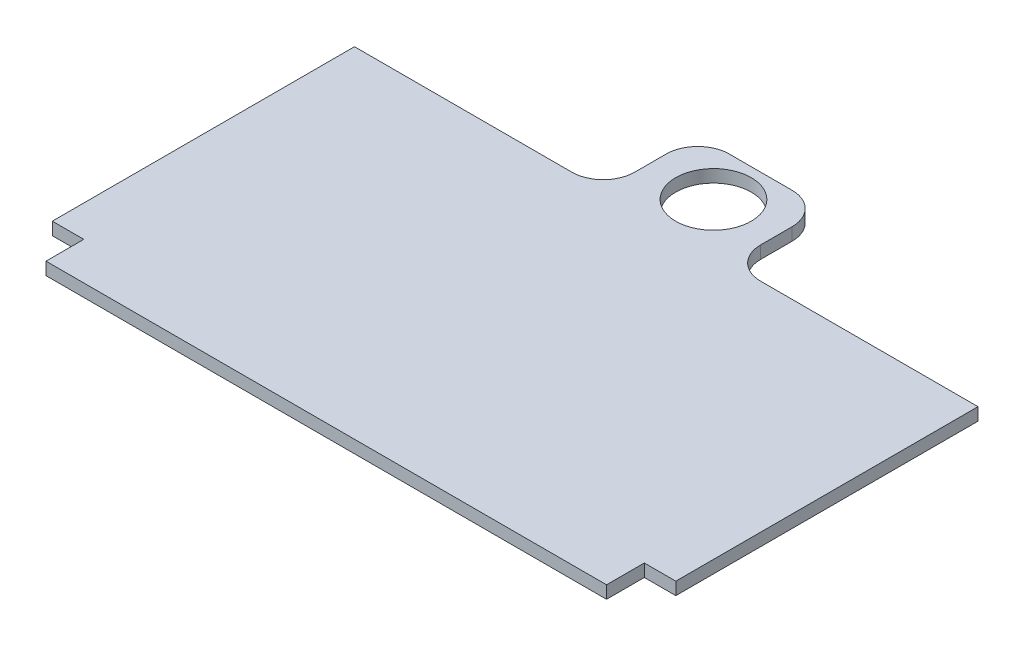
ISO-10303-21;
HEADER;
FILE_DESCRIPTION(('STEP AP214'),'2;1');
FILE_NAME('part.step','',(''),(''),'','','');
FILE_SCHEMA(('AUTOMOTIVE_DESIGN { 1 0 10303 214 1 1 1 1 }'));
ENDSEC;
DATA;
#1=APPLICATION_CONTEXT('core data for automotive mechanical design processes');
#2=APPLICATION_PROTOCOL_DEFINITION('international standard','automotive_design',2000,#1);
#3=PRODUCT_CONTEXT('',#1,'mechanical');
#4=PRODUCT('Part','Part','',(#3));
#5=PRODUCT_RELATED_PRODUCT_CATEGORY('part','',(#4));
#6=PRODUCT_DEFINITION_FORMATION('','',#4);
#7=PRODUCT_DEFINITION_CONTEXT('part definition',#1,'design');
#8=PRODUCT_DEFINITION('design','',#6,#7);
#9=PRODUCT_DEFINITION_SHAPE('','',#8);
#10=(LENGTH_UNIT() NAMED_UNIT(*) SI_UNIT(.MILLI.,.METRE.));
#11=(NAMED_UNIT(*) PLANE_ANGLE_UNIT() SI_UNIT($,.RADIAN.));
#12=(NAMED_UNIT(*) SI_UNIT($,.STERADIAN.) SOLID_ANGLE_UNIT());
#13=UNCERTAINTY_MEASURE_WITH_UNIT(LENGTH_MEASURE(1.E-05),#10,'distance_accuracy_value','');
#14=(GEOMETRIC_REPRESENTATION_CONTEXT(3) GLOBAL_UNCERTAINTY_ASSIGNED_CONTEXT((#13)) GLOBAL_UNIT_ASSIGNED_CONTEXT((#10,
#11,#12)) REPRESENTATION_CONTEXT('',''));
#15=CARTESIAN_POINT('',(0.,0.,0.));
#16=DIRECTION('',(0.,0.,1.));
#17=DIRECTION('',(1.,0.,0.));
#18=AXIS2_PLACEMENT_3D('',#15,#16,#17);
#19=CARTESIAN_POINT('',(0.,0.,-48.));
#20=DIRECTION('',(0.,0.,-1.));
#21=DIRECTION('',(0.,-1.,0.));
#22=AXIS2_PLACEMENT_3D('',#19,#20,#21);
#23=PLANE('',#22);
#24=DIRECTION('',(-1.,0.,0.));
#25=VECTOR('',#24,1.);
#26=CARTESIAN_POINT('',(85.,-86.5,-48.));
#27=LINE('',#26,#25);
#28=CARTESIAN_POINT('',(179.030435910037,-86.5,-48.));
#29=VERTEX_POINT('',#28);
#30=CARTESIAN_POINT('',(144.515217955019,-86.5,-48.));
#31=VERTEX_POINT('',#30);
#32=EDGE_CURVE('E212',#29,#31,#27,.T.);
#33=ORIENTED_EDGE('',*,*,#32,.F.);
#34=DIRECTION('',(0.,1.,0.));
#35=VECTOR('',#34,1.);
#36=CARTESIAN_POINT('',(179.030435910037,-86.5,-48.));
#37=LINE('',#36,#35);
#38=CARTESIAN_POINT('',(179.030435910037,-88.5,-48.));
#39=VERTEX_POINT('',#38);
#40=EDGE_CURVE('E201',#39,#29,#37,.T.);
#41=ORIENTED_EDGE('',*,*,#40,.F.);
#42=DIRECTION('',(1.,0.,0.));
#43=VECTOR('',#42,1.);
#44=CARTESIAN_POINT('',(85.,-88.5,-48.));
#45=LINE('',#44,#43);
#46=CARTESIAN_POINT('',(144.515217955019,-88.5,-48.));
#47=VERTEX_POINT('',#46);
#48=EDGE_CURVE('E183',#47,#39,#45,.T.);
#49=ORIENTED_EDGE('',*,*,#48,.F.);
#50=DIRECTION('',(0.,-1.,0.));
#51=VECTOR('',#50,1.);
#52=CARTESIAN_POINT('',(144.515217955019,-88.5,-48.));
#53=LINE('',#52,#51);
#54=EDGE_CURVE('E182',#31,#47,#53,.T.);
#55=ORIENTED_EDGE('',*,*,#54,.F.);
#56=EDGE_LOOP('',(#33,#41,#49,#55));
#57=FACE_BOUND('',#56,.T.);
#58=ADVANCED_FACE('F39',(#57),#23,.T.);
#59=CARTESIAN_POINT('',(85.,-86.5,-137.052897304531));
#60=DIRECTION('',(1.,0.,0.));
#61=DIRECTION('',(0.,0.,1.));
#62=AXIS2_PLACEMENT_3D('',#59,#60,#61);
#63=PLANE('',#62);
#64=DIRECTION('',(0.,0.,1.));
#65=VECTOR('',#64,1.);
#66=CARTESIAN_POINT('',(85.,-88.5,-137.052897304531));
#67=LINE('',#66,#65);
#68=CARTESIAN_POINT('',(85.,-88.5,0.));
#69=VERTEX_POINT('',#68);
#70=CARTESIAN_POINT('',(85.,-88.5,6.00000000000001));
#71=VERTEX_POINT('',#70);
#72=EDGE_CURVE('E356',#69,#71,#67,.T.);
#73=ORIENTED_EDGE('',*,*,#72,.T.);
#74=DIRECTION('',(0.,1.,0.));
#75=VECTOR('',#74,1.);
#76=CARTESIAN_POINT('',(85.,-86.5,6.00000000000001));
#77=LINE('',#76,#75);
#78=CARTESIAN_POINT('',(85.,-86.5,6.00000000000001));
#79=VERTEX_POINT('',#78);
#80=EDGE_CURVE('E347',#71,#79,#77,.T.);
#81=ORIENTED_EDGE('',*,*,#80,.T.);
#82=DIRECTION('',(0.,0.,1.));
#83=VECTOR('',#82,1.);
#84=CARTESIAN_POINT('',(85.,-86.5,-137.052897304531));
#85=LINE('',#84,#83);
#86=CARTESIAN_POINT('',(85.,-86.5,0.));
#87=VERTEX_POINT('',#86);
#88=EDGE_CURVE('E351',#87,#79,#85,.T.);
#89=ORIENTED_EDGE('',*,*,#88,.F.);
#90=DIRECTION('',(0.,1.,0.));
#91=VECTOR('',#90,1.);
#92=CARTESIAN_POINT('',(85.,-86.5,0.));
#93=LINE('',#92,#91);
#94=EDGE_CURVE('E172',#69,#87,#93,.T.);
#95=ORIENTED_EDGE('',*,*,#94,.F.);
#96=EDGE_LOOP('',(#73,#81,#89,#95));
#97=FACE_BOUND('',#96,.T.);
#98=ADVANCED_FACE('F393',(#97),#63,.F.);
#99=CARTESIAN_POINT('',(174.030435910037,-86.5,-137.052897304531));
#100=DIRECTION('',(-1.,0.,0.));
#101=DIRECTION('',(0.,0.,-1.));
#102=AXIS2_PLACEMENT_3D('',#99,#100,#101);
#103=PLANE('',#102);
#104=DIRECTION('',(0.,1.,0.));
#105=VECTOR('',#104,1.);
#106=CARTESIAN_POINT('',(174.030435910037,-86.5,0.));
#107=LINE('',#106,#105);
#108=CARTESIAN_POINT('',(174.030435910037,-88.5,0.));
#109=VERTEX_POINT('',#108);
#110=CARTESIAN_POINT('',(174.030435910037,-86.5,0.));
#111=VERTEX_POINT('',#110);
#112=EDGE_CURVE('E316',#109,#111,#107,.T.);
#113=ORIENTED_EDGE('',*,*,#112,.T.);
#114=DIRECTION('',(0.,0.,1.));
#115=VECTOR('',#114,1.);
#116=CARTESIAN_POINT('',(174.030435910037,-86.5,-137.052897304531));
#117=LINE('',#116,#115);
#118=CARTESIAN_POINT('',(174.030435910037,-86.5,6.00000000000001));
#119=VERTEX_POINT('',#118);
#120=EDGE_CURVE('E228',#111,#119,#117,.T.);
#121=ORIENTED_EDGE('',*,*,#120,.T.);
#122=DIRECTION('',(0.,-1.,0.));
#123=VECTOR('',#122,1.);
#124=CARTESIAN_POINT('',(174.030435910037,-86.5,6.00000000000001));
#125=LINE('',#124,#123);
#126=CARTESIAN_POINT('',(174.030435910037,-88.5,6.00000000000003));
#127=VERTEX_POINT('',#126);
#128=EDGE_CURVE('E339',#119,#127,#125,.T.);
#129=ORIENTED_EDGE('',*,*,#128,.T.);
#130=DIRECTION('',(0.,0.,1.));
#131=VECTOR('',#130,1.);
#132=CARTESIAN_POINT('',(174.030435910037,-88.5,-137.052897304531));
#133=LINE('',#132,#131);
#134=EDGE_CURVE('E361',#109,#127,#133,.T.);
#135=ORIENTED_EDGE('',*,*,#134,.F.);
#136=EDGE_LOOP('',(#113,#121,#129,#135));
#137=FACE_BOUND('',#136,.T.);
#138=ADVANCED_FACE('F398',(#137),#103,.F.);
#139=CARTESIAN_POINT('',(85.,-88.5,-137.052897304531));
#140=DIRECTION('',(0.,1.,0.));
#141=DIRECTION('',(0.,0.,-1.));
#142=AXIS2_PLACEMENT_3D('',#139,#140,#141);
#143=PLANE('',#142);
#144=CARTESIAN_POINT('',(129.515217955019,-88.5,-55.5));
#145=DIRECTION('',(0.,1.,0.));
#146=DIRECTION('',(0.,0.,1.));
#147=AXIS2_PLACEMENT_3D('',#144,#145,#146);
#148=CIRCLE('',#147,6.00000000000002);
#149=CARTESIAN_POINT('',(129.515217955019,-88.5,-49.5));
#150=VERTEX_POINT('',#149);
#151=EDGE_CURVE('E260',#150,#150,#148,.T.);
#152=ORIENTED_EDGE('',*,*,#151,.T.);
#153=EDGE_LOOP('',(#152));
#154=FACE_BOUND('',#153,.T.);
#155=DIRECTION('',(-1.,0.,0.));
#156=VECTOR('',#155,1.);
#157=CARTESIAN_POINT('',(119.515217955019,-88.5,-63.));
#158=LINE('',#157,#156);
#159=CARTESIAN_POINT('',(134.515217955019,-88.5,-63.));
#160=VERTEX_POINT('',#159);
#161=CARTESIAN_POINT('',(124.515217955019,-88.5,-63.));
#162=VERTEX_POINT('',#161);
#163=EDGE_CURVE('E257',#160,#162,#158,.T.);
#164=ORIENTED_EDGE('',*,*,#163,.F.);
#165=CARTESIAN_POINT('',(134.515217955019,-88.5,-58.));
#166=DIRECTION('',(0.,-1.,0.));
#167=DIRECTION('',(0.,0.,-1.));
#168=AXIS2_PLACEMENT_3D('',#165,#166,#167);
#169=CIRCLE('',#168,5.);
#170=CARTESIAN_POINT('',(139.515217955019,-88.5,-58.));
#171=VERTEX_POINT('',#170);
#172=EDGE_CURVE('E234',#171,#160,#169,.F.);
#173=ORIENTED_EDGE('',*,*,#172,.F.);
#174=DIRECTION('',(0.,0.,-1.));
#175=VECTOR('',#174,1.);
#176=CARTESIAN_POINT('',(139.515217955019,-88.5,-48.));
#177=LINE('',#176,#175);
#178=CARTESIAN_POINT('',(139.515217955019,-88.5,-53.));
#179=VERTEX_POINT('',#178);
#180=EDGE_CURVE('E253',#179,#171,#177,.T.);
#181=ORIENTED_EDGE('',*,*,#180,.F.);
#182=CARTESIAN_POINT('',(144.515217955019,-88.5,-53.));
#183=DIRECTION('',(0.,-1.,0.));
#184=DIRECTION('',(0.,0.,-1.));
#185=AXIS2_PLACEMENT_3D('',#182,#183,#184);
#186=CIRCLE('',#185,5.);
#187=EDGE_CURVE('E243',#47,#179,#186,.T.);
#188=ORIENTED_EDGE('',*,*,#187,.F.);
#189=ORIENTED_EDGE('',*,*,#48,.T.);
#190=DIRECTION('',(0.,0.,1.));
#191=VECTOR('',#190,1.);
#192=CARTESIAN_POINT('',(179.030435910037,-88.5,0.));
#193=LINE('',#192,#191);
#194=CARTESIAN_POINT('',(179.030435910037,-88.5,0.));
#195=VERTEX_POINT('',#194);
#196=EDGE_CURVE('E310',#39,#195,#193,.T.);
#197=ORIENTED_EDGE('',*,*,#196,.T.);
#198=DIRECTION('',(-1.,0.,0.));
#199=VECTOR('',#198,1.);
#200=CARTESIAN_POINT('',(179.030435910037,-88.5,0.));
#201=LINE('',#200,#199);
#202=EDGE_CURVE('E333',#195,#109,#201,.T.);
#203=ORIENTED_EDGE('',*,*,#202,.T.);
#204=ORIENTED_EDGE('',*,*,#134,.T.);
#205=DIRECTION('',(-1.,0.,0.));
#206=VECTOR('',#205,1.);
#207=CARTESIAN_POINT('',(85.,-88.5,6.00000000000001));
#208=LINE('',#207,#206);
#209=EDGE_CURVE('E349',#127,#71,#208,.T.);
#210=ORIENTED_EDGE('',*,*,#209,.T.);
#211=ORIENTED_EDGE('',*,*,#72,.F.);
#212=DIRECTION('',(1.,0.,0.));
#213=VECTOR('',#212,1.);
#214=CARTESIAN_POINT('',(80.,-88.5,0.));
#215=LINE('',#214,#213);
#216=CARTESIAN_POINT('',(80.,-88.5,0.));
#217=VERTEX_POINT('',#216);
#218=EDGE_CURVE('E188',#217,#69,#215,.T.);
#219=ORIENTED_EDGE('',*,*,#218,.F.);
#220=DIRECTION('',(0.,0.,1.));
#221=VECTOR('',#220,1.);
#222=CARTESIAN_POINT('',(80.,-88.5,0.));
#223=LINE('',#222,#221);
#224=CARTESIAN_POINT('',(80.,-88.5,-48.));
#225=VERTEX_POINT('',#224);
#226=EDGE_CURVE('E165',#225,#217,#223,.T.);
#227=ORIENTED_EDGE('',*,*,#226,.F.);
#228=CARTESIAN_POINT('',(114.515217955019,-88.5,-48.));
#229=VERTEX_POINT('',#228);
#230=EDGE_CURVE('E176',#225,#229,#45,.T.);
#231=ORIENTED_EDGE('',*,*,#230,.T.);
#232=CARTESIAN_POINT('',(114.515217955019,-88.5,-53.));
#233=DIRECTION('',(0.,-1.,0.));
#234=DIRECTION('',(0.,0.,-1.));
#235=AXIS2_PLACEMENT_3D('',#232,#233,#234);
#236=CIRCLE('',#235,5.);
#237=CARTESIAN_POINT('',(119.515217955019,-88.5,-53.));
#238=VERTEX_POINT('',#237);
#239=EDGE_CURVE('E47',#238,#229,#236,.T.);
#240=ORIENTED_EDGE('',*,*,#239,.F.);
#241=DIRECTION('',(0.,0.,1.));
#242=VECTOR('',#241,1.);
#243=CARTESIAN_POINT('',(119.515217955019,-88.5,-48.));
#244=LINE('',#243,#242);
#245=CARTESIAN_POINT('',(119.515217955019,-88.5,-58.));
#246=VERTEX_POINT('',#245);
#247=EDGE_CURVE('E251',#246,#238,#244,.T.);
#248=ORIENTED_EDGE('',*,*,#247,.F.);
#249=CARTESIAN_POINT('',(124.515217955019,-88.5,-58.));
#250=DIRECTION('',(0.,-1.,0.));
#251=DIRECTION('',(0.,0.,-1.));
#252=AXIS2_PLACEMENT_3D('',#249,#250,#251);
#253=CIRCLE('',#252,5.);
#254=EDGE_CURVE('E236',#162,#246,#253,.F.);
#255=ORIENTED_EDGE('',*,*,#254,.F.);
#256=EDGE_LOOP('',(#164,#173,#181,#188,#189,#197,#203,#204,#210,#211,#219,#227,#231,#240,#248,#255));
#257=FACE_BOUND('',#256,.T.);
#258=ADVANCED_FACE('F186',(#154,#257),#143,.F.);
#259=CARTESIAN_POINT('',(85.,-86.5,-137.052897304531));
#260=DIRECTION('',(0.,-1.,0.));
#261=DIRECTION('',(0.,0.,1.));
#262=AXIS2_PLACEMENT_3D('',#259,#260,#261);
#263=PLANE('',#262);
#264=CARTESIAN_POINT('',(129.515217955019,-86.5,-55.5));
#265=DIRECTION('',(0.,1.,0.));
#266=DIRECTION('',(0.,0.,1.));
#267=AXIS2_PLACEMENT_3D('',#264,#265,#266);
#268=CIRCLE('',#267,6.00000000000002);
#269=CARTESIAN_POINT('',(129.515217955019,-86.5,-49.5));
#270=VERTEX_POINT('',#269);
#271=EDGE_CURVE('E254',#270,#270,#268,.T.);
#272=ORIENTED_EDGE('',*,*,#271,.F.);
#273=EDGE_LOOP('',(#272));
#274=FACE_BOUND('',#273,.T.);
#275=DIRECTION('',(0.,0.,-1.));
#276=VECTOR('',#275,1.);
#277=CARTESIAN_POINT('',(119.515217955019,-86.5,-48.));
#278=LINE('',#277,#276);
#279=CARTESIAN_POINT('',(119.515217955019,-86.5,-53.));
#280=VERTEX_POINT('',#279);
#281=CARTESIAN_POINT('',(119.515217955019,-86.5,-58.));
#282=VERTEX_POINT('',#281);
#283=EDGE_CURVE('E173',#280,#282,#278,.T.);
#284=ORIENTED_EDGE('',*,*,#283,.F.);
#285=CARTESIAN_POINT('',(114.515217955019,-86.5,-53.));
#286=DIRECTION('',(0.,1.,0.));
#287=DIRECTION('',(0.,0.,1.));
#288=AXIS2_PLACEMENT_3D('',#285,#286,#287);
#289=CIRCLE('',#288,5.);
#290=CARTESIAN_POINT('',(114.515217955019,-86.5,-48.));
#291=VERTEX_POINT('',#290);
#292=EDGE_CURVE('E11',#291,#280,#289,.T.);
#293=ORIENTED_EDGE('',*,*,#292,.F.);
#294=CARTESIAN_POINT('',(80.,-86.5,-48.));
#295=VERTEX_POINT('',#294);
#296=EDGE_CURVE('E215',#291,#295,#27,.T.);
#297=ORIENTED_EDGE('',*,*,#296,.T.);
#298=DIRECTION('',(0.,0.,-1.));
#299=VECTOR('',#298,1.);
#300=CARTESIAN_POINT('',(80.,-86.5,0.));
#301=LINE('',#300,#299);
#302=CARTESIAN_POINT('',(80.,-86.5,0.));
#303=VERTEX_POINT('',#302);
#304=EDGE_CURVE('E168',#303,#295,#301,.T.);
#305=ORIENTED_EDGE('',*,*,#304,.F.);
#306=DIRECTION('',(1.,0.,0.));
#307=VECTOR('',#306,1.);
#308=CARTESIAN_POINT('',(80.,-86.5,0.));
#309=LINE('',#308,#307);
#310=EDGE_CURVE('E195',#303,#87,#309,.T.);
#311=ORIENTED_EDGE('',*,*,#310,.T.);
#312=ORIENTED_EDGE('',*,*,#88,.T.);
#313=DIRECTION('',(1.,0.,0.));
#314=VECTOR('',#313,1.);
#315=CARTESIAN_POINT('',(85.,-86.5,6.00000000000001));
#316=LINE('',#315,#314);
#317=EDGE_CURVE('E343',#79,#119,#316,.T.);
#318=ORIENTED_EDGE('',*,*,#317,.T.);
#319=ORIENTED_EDGE('',*,*,#120,.F.);
#320=DIRECTION('',(-1.,0.,0.));
#321=VECTOR('',#320,1.);
#322=CARTESIAN_POINT('',(179.030435910037,-86.5,0.));
#323=LINE('',#322,#321);
#324=CARTESIAN_POINT('',(179.030435910037,-86.5,0.));
#325=VERTEX_POINT('',#324);
#326=EDGE_CURVE('E344',#325,#111,#323,.T.);
#327=ORIENTED_EDGE('',*,*,#326,.F.);
#328=DIRECTION('',(0.,0.,-1.));
#329=VECTOR('',#328,1.);
#330=CARTESIAN_POINT('',(179.030435910037,-86.5,0.));
#331=LINE('',#330,#329);
#332=EDGE_CURVE('E327',#325,#29,#331,.T.);
#333=ORIENTED_EDGE('',*,*,#332,.T.);
#334=ORIENTED_EDGE('',*,*,#32,.T.);
#335=CARTESIAN_POINT('',(144.515217955019,-86.5,-53.));
#336=DIRECTION('',(0.,1.,0.));
#337=DIRECTION('',(0.,0.,1.));
#338=AXIS2_PLACEMENT_3D('',#335,#336,#337);
#339=CIRCLE('',#338,5.);
#340=CARTESIAN_POINT('',(139.515217955019,-86.5,-53.));
#341=VERTEX_POINT('',#340);
#342=EDGE_CURVE('E246',#341,#31,#339,.T.);
#343=ORIENTED_EDGE('',*,*,#342,.F.);
#344=DIRECTION('',(0.,0.,1.));
#345=VECTOR('',#344,1.);
#346=CARTESIAN_POINT('',(139.515217955019,-86.5,-48.));
#347=LINE('',#346,#345);
#348=CARTESIAN_POINT('',(139.515217955019,-86.5,-58.));
#349=VERTEX_POINT('',#348);
#350=EDGE_CURVE('E273',#349,#341,#347,.T.);
#351=ORIENTED_EDGE('',*,*,#350,.F.);
#352=CARTESIAN_POINT('',(134.515217955019,-86.5,-58.));
#353=DIRECTION('',(0.,1.,0.));
#354=DIRECTION('',(0.,0.,1.));
#355=AXIS2_PLACEMENT_3D('',#352,#353,#354);
#356=CIRCLE('',#355,5.);
#357=CARTESIAN_POINT('',(134.515217955019,-86.5,-63.));
#358=VERTEX_POINT('',#357);
#359=EDGE_CURVE('E238',#358,#349,#356,.F.);
#360=ORIENTED_EDGE('',*,*,#359,.F.);
#361=DIRECTION('',(1.,0.,0.));
#362=VECTOR('',#361,1.);
#363=CARTESIAN_POINT('',(119.515217955019,-86.5,-63.));
#364=LINE('',#363,#362);
#365=CARTESIAN_POINT('',(124.515217955019,-86.5,-63.));
#366=VERTEX_POINT('',#365);
#367=EDGE_CURVE('E276',#366,#358,#364,.T.);
#368=ORIENTED_EDGE('',*,*,#367,.F.);
#369=CARTESIAN_POINT('',(124.515217955019,-86.5,-58.));
#370=DIRECTION('',(0.,1.,0.));
#371=DIRECTION('',(0.,0.,1.));
#372=AXIS2_PLACEMENT_3D('',#369,#370,#371);
#373=CIRCLE('',#372,5.);
#374=EDGE_CURVE('E241',#282,#366,#373,.F.);
#375=ORIENTED_EDGE('',*,*,#374,.F.);
#376=EDGE_LOOP('',(#284,#293,#297,#305,#311,#312,#318,#319,#327,#333,#334,#343,#351,#360,#368,#375));
#377=FACE_BOUND('',#376,.T.);
#378=ADVANCED_FACE('F288',(#274,#377),#263,.F.);
#379=ORIENTED_EDGE('',*,*,#230,.F.);
#380=DIRECTION('',(0.,1.,0.));
#381=VECTOR('',#380,1.);
#382=CARTESIAN_POINT('',(80.,-86.5,-48.));
#383=LINE('',#382,#381);
#384=EDGE_CURVE('E161',#225,#295,#383,.T.);
#385=ORIENTED_EDGE('',*,*,#384,.T.);
#386=ORIENTED_EDGE('',*,*,#296,.F.);
#387=DIRECTION('',(0.,-1.,0.));
#388=VECTOR('',#387,1.);
#389=CARTESIAN_POINT('',(114.515217955019,-86.5,-48.));
#390=LINE('',#389,#388);
#391=EDGE_CURVE('E178',#229,#291,#390,.F.);
#392=ORIENTED_EDGE('',*,*,#391,.F.);
#393=EDGE_LOOP('',(#379,#385,#386,#392));
#394=FACE_BOUND('',#393,.T.);
#395=ADVANCED_FACE('F177',(#394),#23,.T.);
#396=CARTESIAN_POINT('',(0.,0.,6.));
#397=DIRECTION('',(0.,0.,-1.));
#398=DIRECTION('',(0.,-1.,0.));
#399=AXIS2_PLACEMENT_3D('',#396,#397,#398);
#400=PLANE('',#399);
#401=ORIENTED_EDGE('',*,*,#80,.F.);
#402=ORIENTED_EDGE('',*,*,#209,.F.);
#403=ORIENTED_EDGE('',*,*,#128,.F.);
#404=ORIENTED_EDGE('',*,*,#317,.F.);
#405=EDGE_LOOP('',(#401,#402,#403,#404));
#406=FACE_BOUND('',#405,.T.);
#407=ADVANCED_FACE('F382',(#406),#400,.F.);
#408=CARTESIAN_POINT('',(179.030435910037,-86.5,0.));
#409=DIRECTION('',(0.,0.,-1.));
#410=DIRECTION('',(0.,-1.,0.));
#411=AXIS2_PLACEMENT_3D('',#408,#409,#410);
#412=PLANE('',#411);
#413=ORIENTED_EDGE('',*,*,#112,.F.);
#414=ORIENTED_EDGE('',*,*,#202,.F.);
#415=DIRECTION('',(0.,1.,0.));
#416=VECTOR('',#415,1.);
#417=CARTESIAN_POINT('',(179.030435910037,-86.5,0.));
#418=LINE('',#417,#416);
#419=EDGE_CURVE('E319',#195,#325,#418,.T.);
#420=ORIENTED_EDGE('',*,*,#419,.T.);
#421=ORIENTED_EDGE('',*,*,#326,.T.);
#422=EDGE_LOOP('',(#413,#414,#420,#421));
#423=FACE_BOUND('',#422,.T.);
#424=ADVANCED_FACE('F380',(#423),#412,.F.);
#425=CARTESIAN_POINT('',(179.030435910037,0.,0.));
#426=DIRECTION('',(-1.,0.,0.));
#427=DIRECTION('',(0.,0.,-1.));
#428=AXIS2_PLACEMENT_3D('',#425,#426,#427);
#429=PLANE('',#428);
#430=ORIENTED_EDGE('',*,*,#419,.F.);
#431=ORIENTED_EDGE('',*,*,#196,.F.);
#432=ORIENTED_EDGE('',*,*,#40,.T.);
#433=ORIENTED_EDGE('',*,*,#332,.F.);
#434=EDGE_LOOP('',(#430,#431,#432,#433));
#435=FACE_BOUND('',#434,.T.);
#436=ADVANCED_FACE('F379',(#435),#429,.F.);
#437=CARTESIAN_POINT('',(80.,-86.5,0.));
#438=DIRECTION('',(0.,0.,1.));
#439=DIRECTION('',(0.,1.,0.));
#440=AXIS2_PLACEMENT_3D('',#437,#438,#439);
#441=PLANE('',#440);
#442=ORIENTED_EDGE('',*,*,#94,.T.);
#443=ORIENTED_EDGE('',*,*,#310,.F.);
#444=DIRECTION('',(0.,1.,0.));
#445=VECTOR('',#444,1.);
#446=CARTESIAN_POINT('',(80.,-86.5,0.));
#447=LINE('',#446,#445);
#448=EDGE_CURVE('E190',#217,#303,#447,.T.);
#449=ORIENTED_EDGE('',*,*,#448,.F.);
#450=ORIENTED_EDGE('',*,*,#218,.T.);
#451=EDGE_LOOP('',(#442,#443,#449,#450));
#452=FACE_BOUND('',#451,.T.);
#453=ADVANCED_FACE('F388',(#452),#441,.T.);
#454=CARTESIAN_POINT('',(80.,0.,0.));
#455=DIRECTION('',(1.,0.,0.));
#456=DIRECTION('',(0.,0.,-1.));
#457=AXIS2_PLACEMENT_3D('',#454,#455,#456);
#458=PLANE('',#457);
#459=ORIENTED_EDGE('',*,*,#448,.T.);
#460=ORIENTED_EDGE('',*,*,#304,.T.);
#461=ORIENTED_EDGE('',*,*,#384,.F.);
#462=ORIENTED_EDGE('',*,*,#226,.T.);
#463=EDGE_LOOP('',(#459,#460,#461,#462));
#464=FACE_BOUND('',#463,.T.);
#465=ADVANCED_FACE('F163',(#464),#458,.F.);
#466=CARTESIAN_POINT('',(119.515217955019,-61.5,-48.));
#467=DIRECTION('',(-1.,0.,0.));
#468=DIRECTION('',(0.,0.,-1.));
#469=AXIS2_PLACEMENT_3D('',#466,#467,#468);
#470=PLANE('',#469);
#471=ORIENTED_EDGE('',*,*,#283,.T.);
#472=DIRECTION('',(0.,-1.,0.));
#473=VECTOR('',#472,1.);
#474=CARTESIAN_POINT('',(119.515217955019,-61.5,-58.));
#475=LINE('',#474,#473);
#476=EDGE_CURVE('E265',#246,#282,#475,.F.);
#477=ORIENTED_EDGE('',*,*,#476,.F.);
#478=ORIENTED_EDGE('',*,*,#247,.T.);
#479=DIRECTION('',(0.,-1.,0.));
#480=VECTOR('',#479,1.);
#481=CARTESIAN_POINT('',(119.515217955019,-88.5,-53.));
#482=LINE('',#481,#480);
#483=EDGE_CURVE('E229',#280,#238,#482,.T.);
#484=ORIENTED_EDGE('',*,*,#483,.F.);
#485=EDGE_LOOP('',(#471,#477,#478,#484));
#486=FACE_BOUND('',#485,.T.);
#487=ADVANCED_FACE('F291',(#486),#470,.T.);
#488=CARTESIAN_POINT('',(119.515217955019,-61.5,-63.));
#489=DIRECTION('',(0.,0.,-1.));
#490=DIRECTION('',(1.,0.,0.));
#491=AXIS2_PLACEMENT_3D('',#488,#489,#490);
#492=PLANE('',#491);
#493=ORIENTED_EDGE('',*,*,#367,.T.);
#494=DIRECTION('',(0.,-1.,0.));
#495=VECTOR('',#494,1.);
#496=CARTESIAN_POINT('',(134.515217955019,-61.5,-63.));
#497=LINE('',#496,#495);
#498=EDGE_CURVE('E62',#160,#358,#497,.F.);
#499=ORIENTED_EDGE('',*,*,#498,.F.);
#500=ORIENTED_EDGE('',*,*,#163,.T.);
#501=DIRECTION('',(0.,-1.,0.));
#502=VECTOR('',#501,1.);
#503=CARTESIAN_POINT('',(124.515217955019,-61.5,-63.));
#504=LINE('',#503,#502);
#505=EDGE_CURVE('E54',#366,#162,#504,.T.);
#506=ORIENTED_EDGE('',*,*,#505,.F.);
#507=EDGE_LOOP('',(#493,#499,#500,#506));
#508=FACE_BOUND('',#507,.T.);
#509=ADVANCED_FACE('F295',(#508),#492,.T.);
#510=CARTESIAN_POINT('',(139.515217955019,-61.5,-48.));
#511=DIRECTION('',(1.,0.,0.));
#512=DIRECTION('',(0.,0.,1.));
#513=AXIS2_PLACEMENT_3D('',#510,#511,#512);
#514=PLANE('',#513);
#515=ORIENTED_EDGE('',*,*,#180,.T.);
#516=DIRECTION('',(0.,-1.,0.));
#517=VECTOR('',#516,1.);
#518=CARTESIAN_POINT('',(139.515217955019,-61.5,-58.));
#519=LINE('',#518,#517);
#520=EDGE_CURVE('E279',#349,#171,#519,.T.);
#521=ORIENTED_EDGE('',*,*,#520,.F.);
#522=ORIENTED_EDGE('',*,*,#350,.T.);
#523=DIRECTION('',(0.,-1.,0.));
#524=VECTOR('',#523,1.);
#525=CARTESIAN_POINT('',(139.515217955019,-86.5,-53.));
#526=LINE('',#525,#524);
#527=EDGE_CURVE('E280',#179,#341,#526,.F.);
#528=ORIENTED_EDGE('',*,*,#527,.F.);
#529=EDGE_LOOP('',(#515,#521,#522,#528));
#530=FACE_BOUND('',#529,.T.);
#531=ADVANCED_FACE('F301',(#530),#514,.T.);
#532=CARTESIAN_POINT('',(129.515217955019,-78.5,-55.5));
#533=DIRECTION('',(0.,-1.,0.));
#534=DIRECTION('',(0.,0.,1.));
#535=AXIS2_PLACEMENT_3D('',#532,#533,#534);
#536=CYLINDRICAL_SURFACE('',#535,6.00000000000002);
#537=ORIENTED_EDGE('',*,*,#151,.F.);
#538=EDGE_LOOP('',(#537));
#539=FACE_BOUND('',#538,.T.);
#540=ORIENTED_EDGE('',*,*,#271,.T.);
#541=EDGE_LOOP('',(#540));
#542=FACE_BOUND('',#541,.T.);
#543=ADVANCED_FACE('F497',(#539,#542),#536,.F.);
#544=CARTESIAN_POINT('',(144.515217955019,0.,-53.));
#545=DIRECTION('',(0.,1.,0.));
#546=DIRECTION('',(0.,0.,-1.));
#547=AXIS2_PLACEMENT_3D('',#544,#545,#546);
#548=CYLINDRICAL_SURFACE('',#547,5.);
#549=ORIENTED_EDGE('',*,*,#342,.T.);
#550=ORIENTED_EDGE('',*,*,#54,.T.);
#551=ORIENTED_EDGE('',*,*,#187,.T.);
#552=ORIENTED_EDGE('',*,*,#527,.T.);
#553=EDGE_LOOP('',(#549,#550,#551,#552));
#554=FACE_BOUND('',#553,.T.);
#555=ADVANCED_FACE('F304',(#554),#548,.F.);
#556=CARTESIAN_POINT('',(114.515217955019,-61.5,-53.));
#557=DIRECTION('',(0.,1.,0.));
#558=DIRECTION('',(0.,0.,-1.));
#559=AXIS2_PLACEMENT_3D('',#556,#557,#558);
#560=CYLINDRICAL_SURFACE('',#559,5.);
#561=ORIENTED_EDGE('',*,*,#292,.T.);
#562=ORIENTED_EDGE('',*,*,#483,.T.);
#563=ORIENTED_EDGE('',*,*,#239,.T.);
#564=ORIENTED_EDGE('',*,*,#391,.T.);
#565=EDGE_LOOP('',(#561,#562,#563,#564));
#566=FACE_BOUND('',#565,.T.);
#567=ADVANCED_FACE('F248',(#566),#560,.F.);
#568=CARTESIAN_POINT('',(124.515217955019,-61.5,-58.));
#569=DIRECTION('',(0.,-1.,0.));
#570=DIRECTION('',(0.,0.,1.));
#571=AXIS2_PLACEMENT_3D('',#568,#569,#570);
#572=CYLINDRICAL_SURFACE('',#571,5.);
#573=ORIENTED_EDGE('',*,*,#374,.T.);
#574=ORIENTED_EDGE('',*,*,#505,.T.);
#575=ORIENTED_EDGE('',*,*,#254,.T.);
#576=ORIENTED_EDGE('',*,*,#476,.T.);
#577=EDGE_LOOP('',(#573,#574,#575,#576));
#578=FACE_BOUND('',#577,.T.);
#579=ADVANCED_FACE('F283',(#578),#572,.T.);
#580=CARTESIAN_POINT('',(134.515217955019,-61.5,-58.));
#581=DIRECTION('',(0.,-1.,0.));
#582=DIRECTION('',(0.,0.,1.));
#583=AXIS2_PLACEMENT_3D('',#580,#581,#582);
#584=CYLINDRICAL_SURFACE('',#583,5.);
#585=ORIENTED_EDGE('',*,*,#359,.T.);
#586=ORIENTED_EDGE('',*,*,#520,.T.);
#587=ORIENTED_EDGE('',*,*,#172,.T.);
#588=ORIENTED_EDGE('',*,*,#498,.T.);
#589=EDGE_LOOP('',(#585,#586,#587,#588));
#590=FACE_BOUND('',#589,.T.);
#591=ADVANCED_FACE('F41',(#590),#584,.T.);
#592=CLOSED_SHELL('',(#58,#98,#138,#258,#378,#395,#407,#424,#436,#453,#465,#487,#509,#531,#543,
#555,#567,#579,#591));
#593=MANIFOLD_SOLID_BREP('B2',#592);
#594=ADVANCED_BREP_SHAPE_REPRESENTATION('',(#18,#593),#14);
#595=SHAPE_DEFINITION_REPRESENTATION(#9,#594);
ENDSEC;
END-ISO-10303-21;
